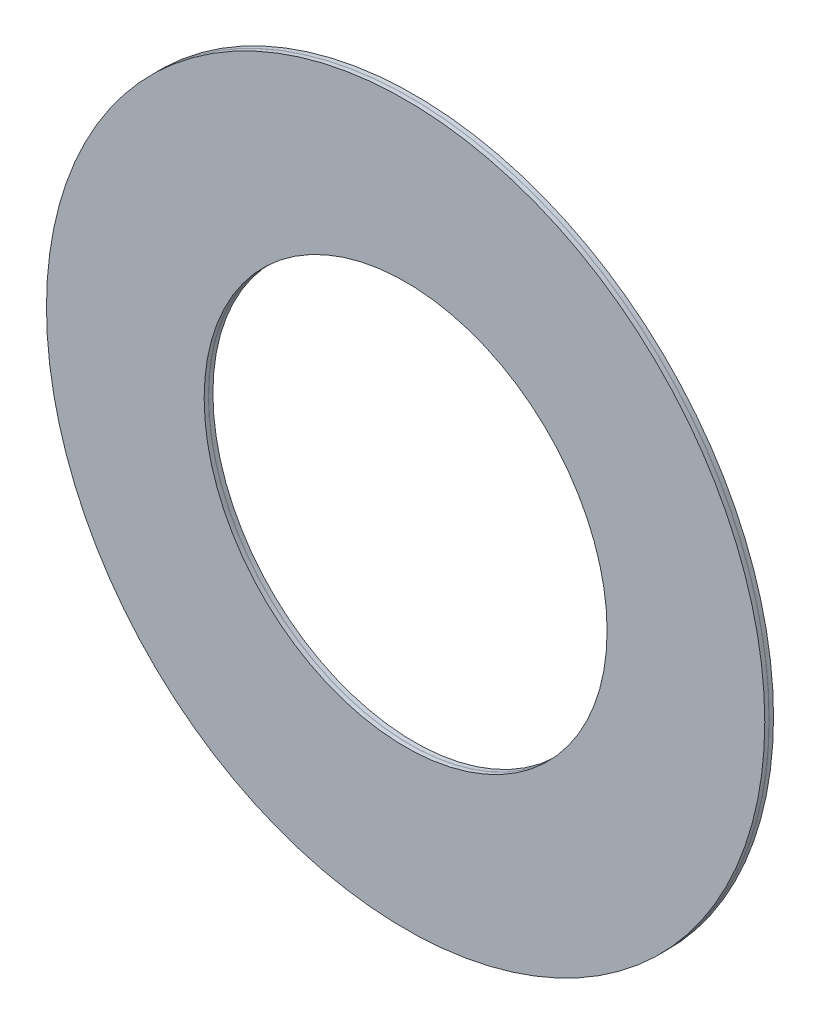
ISO-10303-21;
HEADER;
FILE_DESCRIPTION(('STEP AP214'),'2;1');
FILE_NAME('part.step','',(''),(''),'','','');
FILE_SCHEMA(('AUTOMOTIVE_DESIGN { 1 0 10303 214 1 1 1 1 }'));
ENDSEC;
DATA;
#1=APPLICATION_CONTEXT('core data for automotive mechanical design processes');
#2=APPLICATION_PROTOCOL_DEFINITION('international standard','automotive_design',2000,#1);
#3=PRODUCT_CONTEXT('',#1,'mechanical');
#4=PRODUCT('Part','Part','',(#3));
#5=PRODUCT_RELATED_PRODUCT_CATEGORY('part','',(#4));
#6=PRODUCT_DEFINITION_FORMATION('','',#4);
#7=PRODUCT_DEFINITION_CONTEXT('part definition',#1,'design');
#8=PRODUCT_DEFINITION('design','',#6,#7);
#9=PRODUCT_DEFINITION_SHAPE('','',#8);
#10=(LENGTH_UNIT() NAMED_UNIT(*) SI_UNIT(.MILLI.,.METRE.));
#11=(NAMED_UNIT(*) PLANE_ANGLE_UNIT() SI_UNIT($,.RADIAN.));
#12=(NAMED_UNIT(*) SI_UNIT($,.STERADIAN.) SOLID_ANGLE_UNIT());
#13=UNCERTAINTY_MEASURE_WITH_UNIT(LENGTH_MEASURE(1.E-05),#10,'distance_accuracy_value','');
#14=(GEOMETRIC_REPRESENTATION_CONTEXT(3) GLOBAL_UNCERTAINTY_ASSIGNED_CONTEXT((#13)) GLOBAL_UNIT_ASSIGNED_CONTEXT((#10,
#11,#12)) REPRESENTATION_CONTEXT('',''));
#15=CARTESIAN_POINT('',(0.,0.,0.));
#16=DIRECTION('',(0.,0.,1.));
#17=DIRECTION('',(1.,0.,0.));
#18=AXIS2_PLACEMENT_3D('',#15,#16,#17);
#19=CARTESIAN_POINT('',(0.,36.5125,-0.0253999999999944));
#20=DIRECTION('',(0.,0.,1.));
#21=DIRECTION('',(1.,0.,0.));
#22=AXIS2_PLACEMENT_3D('',#19,#20,#21);
#23=PLANE('',#22);
#24=CARTESIAN_POINT('',(0.,0.,-0.0254000000000014));
#25=DIRECTION('',(0.,0.,-1.));
#26=DIRECTION('',(-1.,0.,0.));
#27=AXIS2_PLACEMENT_3D('',#24,#25,#26);
#28=CIRCLE('',#27,36.5125);
#29=CARTESIAN_POINT('',(-36.5125,0.,-0.0254000000000014));
#30=VERTEX_POINT('',#29);
#31=EDGE_CURVE('E62',#30,#30,#28,.T.);
#32=ORIENTED_EDGE('',*,*,#31,.T.);
#33=EDGE_LOOP('',(#32));
#34=FACE_BOUND('',#33,.T.);
#35=CARTESIAN_POINT('',(0.,0.,-0.0253999999999874));
#36=DIRECTION('',(0.,0.,-1.));
#37=DIRECTION('',(-1.,0.,0.));
#38=AXIS2_PLACEMENT_3D('',#35,#36,#37);
#39=CIRCLE('',#38,65.0875);
#40=CARTESIAN_POINT('',(-65.0875,0.,-0.0253999999999874));
#41=VERTEX_POINT('',#40);
#42=EDGE_CURVE('E11',#41,#41,#39,.T.);
#43=ORIENTED_EDGE('',*,*,#42,.F.);
#44=EDGE_LOOP('',(#43));
#45=FACE_BOUND('',#44,.T.);
#46=ADVANCED_FACE('F48',(#34,#45),#23,.T.);
#47=CARTESIAN_POINT('',(0.,0.,-0.793750000000004));
#48=DIRECTION('',(0.,0.,-1.));
#49=DIRECTION('',(-1.,0.,0.));
#50=AXIS2_PLACEMENT_3D('',#47,#48,#49);
#51=CYLINDRICAL_SURFACE('',#50,65.0875);
#52=ORIENTED_EDGE('',*,*,#42,.T.);
#53=EDGE_LOOP('',(#52));
#54=FACE_BOUND('',#53,.T.);
#55=CARTESIAN_POINT('',(0.,0.,-0.793750000000027));
#56=DIRECTION('',(0.,0.,-1.));
#57=DIRECTION('',(-1.,0.,0.));
#58=AXIS2_PLACEMENT_3D('',#55,#56,#57);
#59=CIRCLE('',#58,65.0875);
#60=CARTESIAN_POINT('',(-65.0875,0.,-0.793750000000027));
#61=VERTEX_POINT('',#60);
#62=EDGE_CURVE('E54',#61,#61,#59,.T.);
#63=ORIENTED_EDGE('',*,*,#62,.F.);
#64=EDGE_LOOP('',(#63));
#65=FACE_BOUND('',#64,.T.);
#66=ADVANCED_FACE('F78',(#54,#65),#51,.T.);
#67=CARTESIAN_POINT('',(0.,65.0875,-0.793750000000013));
#68=DIRECTION('',(0.,0.,-1.));
#69=DIRECTION('',(-1.,0.,0.));
#70=AXIS2_PLACEMENT_3D('',#67,#68,#69);
#71=PLANE('',#70);
#72=ORIENTED_EDGE('',*,*,#62,.T.);
#73=EDGE_LOOP('',(#72));
#74=FACE_BOUND('',#73,.T.);
#75=CARTESIAN_POINT('',(0.,0.,-0.793749999999998));
#76=DIRECTION('',(0.,0.,-1.));
#77=DIRECTION('',(-1.,0.,0.));
#78=AXIS2_PLACEMENT_3D('',#75,#76,#77);
#79=CIRCLE('',#78,36.5125);
#80=CARTESIAN_POINT('',(-36.5125,0.,-0.793749999999998));
#81=VERTEX_POINT('',#80);
#82=EDGE_CURVE('E58',#81,#81,#79,.T.);
#83=ORIENTED_EDGE('',*,*,#82,.F.);
#84=EDGE_LOOP('',(#83));
#85=FACE_BOUND('',#84,.T.);
#86=ADVANCED_FACE('F72',(#74,#85),#71,.T.);
#87=CARTESIAN_POINT('',(0.,0.,-0.793750000000004));
#88=DIRECTION('',(0.,0.,-1.));
#89=DIRECTION('',(-1.,0.,0.));
#90=AXIS2_PLACEMENT_3D('',#87,#88,#89);
#91=CYLINDRICAL_SURFACE('',#90,36.5125);
#92=ORIENTED_EDGE('',*,*,#82,.T.);
#93=EDGE_LOOP('',(#92));
#94=FACE_BOUND('',#93,.T.);
#95=ORIENTED_EDGE('',*,*,#31,.F.);
#96=EDGE_LOOP('',(#95));
#97=FACE_BOUND('',#96,.T.);
#98=ADVANCED_FACE('F70',(#94,#97),#91,.F.);
#99=CLOSED_SHELL('',(#46,#66,#86,#98));
#100=MANIFOLD_SOLID_BREP('B2',#99);
#101=CARTESIAN_POINT('',(0.,36.5125,0.0254000000000109));
#102=DIRECTION('',(0.,0.,-1.));
#103=DIRECTION('',(-1.,0.,0.));
#104=AXIS2_PLACEMENT_3D('',#101,#102,#103);
#105=PLANE('',#104);
#106=CARTESIAN_POINT('',(0.,0.,0.0254000000000127));
#107=DIRECTION('',(0.,0.,-1.));
#108=DIRECTION('',(-1.,0.,0.));
#109=AXIS2_PLACEMENT_3D('',#106,#107,#108);
#110=CIRCLE('',#109,65.0875);
#111=CARTESIAN_POINT('',(-65.0875,0.,0.0254000000000127));
#112=VERTEX_POINT('',#111);
#113=EDGE_CURVE('E47',#112,#112,#110,.T.);
#114=ORIENTED_EDGE('',*,*,#113,.T.);
#115=EDGE_LOOP('',(#114));
#116=FACE_BOUND('',#115,.T.);
#117=CARTESIAN_POINT('',(0.,0.,0.0254000000000092));
#118=DIRECTION('',(0.,0.,-1.));
#119=DIRECTION('',(-1.,0.,0.));
#120=AXIS2_PLACEMENT_3D('',#117,#118,#119);
#121=CIRCLE('',#120,36.5125);
#122=CARTESIAN_POINT('',(-36.5125,0.,0.0254000000000092));
#123=VERTEX_POINT('',#122);
#124=EDGE_CURVE('E123',#123,#123,#121,.T.);
#125=ORIENTED_EDGE('',*,*,#124,.F.);
#126=EDGE_LOOP('',(#125));
#127=FACE_BOUND('',#126,.T.);
#128=ADVANCED_FACE('F109',(#116,#127),#105,.T.);
#129=CARTESIAN_POINT('',(0.,0.,-0.793750000000004));
#130=DIRECTION('',(0.,0.,-1.));
#131=DIRECTION('',(-1.,0.,0.));
#132=AXIS2_PLACEMENT_3D('',#129,#130,#131);
#133=CYLINDRICAL_SURFACE('',#132,65.0875);
#134=CARTESIAN_POINT('',(0.,0.,0.793750000000027));
#135=DIRECTION('',(0.,0.,-1.));
#136=DIRECTION('',(-1.,0.,0.));
#137=AXIS2_PLACEMENT_3D('',#134,#135,#136);
#138=CIRCLE('',#137,65.0875);
#139=CARTESIAN_POINT('',(-65.0875,0.,0.793750000000027));
#140=VERTEX_POINT('',#139);
#141=EDGE_CURVE('E115',#140,#140,#138,.T.);
#142=ORIENTED_EDGE('',*,*,#141,.T.);
#143=EDGE_LOOP('',(#142));
#144=FACE_BOUND('',#143,.T.);
#145=ORIENTED_EDGE('',*,*,#113,.F.);
#146=EDGE_LOOP('',(#145));
#147=FACE_BOUND('',#146,.T.);
#148=ADVANCED_FACE('F133',(#144,#147),#133,.T.);
#149=CARTESIAN_POINT('',(0.,65.0875,0.793750000000013));
#150=DIRECTION('',(0.,0.,1.));
#151=DIRECTION('',(1.,0.,0.));
#152=AXIS2_PLACEMENT_3D('',#149,#150,#151);
#153=PLANE('',#152);
#154=CARTESIAN_POINT('',(0.,0.,0.793749999999998));
#155=DIRECTION('',(0.,0.,-1.));
#156=DIRECTION('',(-1.,0.,0.));
#157=AXIS2_PLACEMENT_3D('',#154,#155,#156);
#158=CIRCLE('',#157,36.5125);
#159=CARTESIAN_POINT('',(-36.5125,0.,0.793749999999998));
#160=VERTEX_POINT('',#159);
#161=EDGE_CURVE('E119',#160,#160,#158,.T.);
#162=ORIENTED_EDGE('',*,*,#161,.T.);
#163=EDGE_LOOP('',(#162));
#164=FACE_BOUND('',#163,.T.);
#165=ORIENTED_EDGE('',*,*,#141,.F.);
#166=EDGE_LOOP('',(#165));
#167=FACE_BOUND('',#166,.T.);
#168=ADVANCED_FACE('F137',(#164,#167),#153,.T.);
#169=CARTESIAN_POINT('',(0.,0.,-0.793750000000004));
#170=DIRECTION('',(0.,0.,-1.));
#171=DIRECTION('',(-1.,0.,0.));
#172=AXIS2_PLACEMENT_3D('',#169,#170,#171);
#173=CYLINDRICAL_SURFACE('',#172,36.5125);
#174=ORIENTED_EDGE('',*,*,#124,.T.);
#175=EDGE_LOOP('',(#174));
#176=FACE_BOUND('',#175,.T.);
#177=ORIENTED_EDGE('',*,*,#161,.F.);
#178=EDGE_LOOP('',(#177));
#179=FACE_BOUND('',#178,.T.);
#180=ADVANCED_FACE('F129',(#176,#179),#173,.F.);
#181=CLOSED_SHELL('',(#128,#148,#168,#180));
#182=MANIFOLD_SOLID_BREP('B6',#181);
#183=CARTESIAN_POINT('',(0.,36.5125,-0.0253999999999944));
#184=DIRECTION('',(0.,0.,-1.));
#185=DIRECTION('',(-1.,0.,0.));
#186=AXIS2_PLACEMENT_3D('',#183,#184,#185);
#187=PLANE('',#186);
#188=CARTESIAN_POINT('',(0.,0.,-0.0253999999999874));
#189=DIRECTION('',(0.,0.,-1.));
#190=DIRECTION('',(-1.,0.,0.));
#191=AXIS2_PLACEMENT_3D('',#188,#189,#190);
#192=CIRCLE('',#191,65.0875);
#193=CARTESIAN_POINT('',(-65.0875,0.,-0.0253999999999874));
#194=VERTEX_POINT('',#193);
#195=EDGE_CURVE('E177',#194,#194,#192,.T.);
#196=ORIENTED_EDGE('',*,*,#195,.T.);
#197=EDGE_LOOP('',(#196));
#198=FACE_BOUND('',#197,.T.);
#199=CARTESIAN_POINT('',(0.,0.,-0.0254000000000014));
#200=DIRECTION('',(0.,0.,-1.));
#201=DIRECTION('',(-1.,0.,0.));
#202=AXIS2_PLACEMENT_3D('',#199,#200,#201);
#203=CIRCLE('',#202,36.5125);
#204=CARTESIAN_POINT('',(-36.5125,0.,-0.0254000000000014));
#205=VERTEX_POINT('',#204);
#206=EDGE_CURVE('E108',#205,#205,#203,.T.);
#207=ORIENTED_EDGE('',*,*,#206,.F.);
#208=EDGE_LOOP('',(#207));
#209=FACE_BOUND('',#208,.T.);
#210=ADVANCED_FACE('F163',(#198,#209),#187,.T.);
#211=CARTESIAN_POINT('',(0.,0.,-0.793750000000004));
#212=DIRECTION('',(0.,0.,-1.));
#213=DIRECTION('',(-1.,0.,0.));
#214=AXIS2_PLACEMENT_3D('',#211,#212,#213);
#215=CYLINDRICAL_SURFACE('',#214,36.5125);
#216=ORIENTED_EDGE('',*,*,#206,.T.);
#217=EDGE_LOOP('',(#216));
#218=FACE_BOUND('',#217,.T.);
#219=CARTESIAN_POINT('',(0.,0.,0.0254000000000092));
#220=DIRECTION('',(0.,0.,-1.));
#221=DIRECTION('',(-1.,0.,0.));
#222=AXIS2_PLACEMENT_3D('',#219,#220,#221);
#223=CIRCLE('',#222,36.5125);
#224=CARTESIAN_POINT('',(-36.5125,0.,0.0254000000000092));
#225=VERTEX_POINT('',#224);
#226=EDGE_CURVE('E169',#225,#225,#223,.T.);
#227=ORIENTED_EDGE('',*,*,#226,.F.);
#228=EDGE_LOOP('',(#227));
#229=FACE_BOUND('',#228,.T.);
#230=ADVANCED_FACE('F193',(#218,#229),#215,.F.);
#231=CARTESIAN_POINT('',(0.,65.0875,0.0254000000000109));
#232=DIRECTION('',(0.,0.,1.));
#233=DIRECTION('',(1.,0.,0.));
#234=AXIS2_PLACEMENT_3D('',#231,#232,#233);
#235=PLANE('',#234);
#236=ORIENTED_EDGE('',*,*,#226,.T.);
#237=EDGE_LOOP('',(#236));
#238=FACE_BOUND('',#237,.T.);
#239=CARTESIAN_POINT('',(0.,0.,0.0254000000000127));
#240=DIRECTION('',(0.,0.,-1.));
#241=DIRECTION('',(-1.,0.,0.));
#242=AXIS2_PLACEMENT_3D('',#239,#240,#241);
#243=CIRCLE('',#242,65.0875);
#244=CARTESIAN_POINT('',(-65.0875,0.,0.0254000000000127));
#245=VERTEX_POINT('',#244);
#246=EDGE_CURVE('E173',#245,#245,#243,.T.);
#247=ORIENTED_EDGE('',*,*,#246,.F.);
#248=EDGE_LOOP('',(#247));
#249=FACE_BOUND('',#248,.T.);
#250=ADVANCED_FACE('F187',(#238,#249),#235,.T.);
#251=CARTESIAN_POINT('',(0.,0.,-0.793750000000004));
#252=DIRECTION('',(0.,0.,-1.));
#253=DIRECTION('',(-1.,0.,0.));
#254=AXIS2_PLACEMENT_3D('',#251,#252,#253);
#255=CYLINDRICAL_SURFACE('',#254,65.0875);
#256=ORIENTED_EDGE('',*,*,#246,.T.);
#257=EDGE_LOOP('',(#256));
#258=FACE_BOUND('',#257,.T.);
#259=ORIENTED_EDGE('',*,*,#195,.F.);
#260=EDGE_LOOP('',(#259));
#261=FACE_BOUND('',#260,.T.);
#262=ADVANCED_FACE('F185',(#258,#261),#255,.T.);
#263=CLOSED_SHELL('',(#210,#230,#250,#262));
#264=MANIFOLD_SOLID_BREP('B42',#263);
#265=ADVANCED_BREP_SHAPE_REPRESENTATION('',(#18,#100,#182,#264),#14);
#266=SHAPE_DEFINITION_REPRESENTATION(#9,#265);
ENDSEC;
END-ISO-10303-21;
